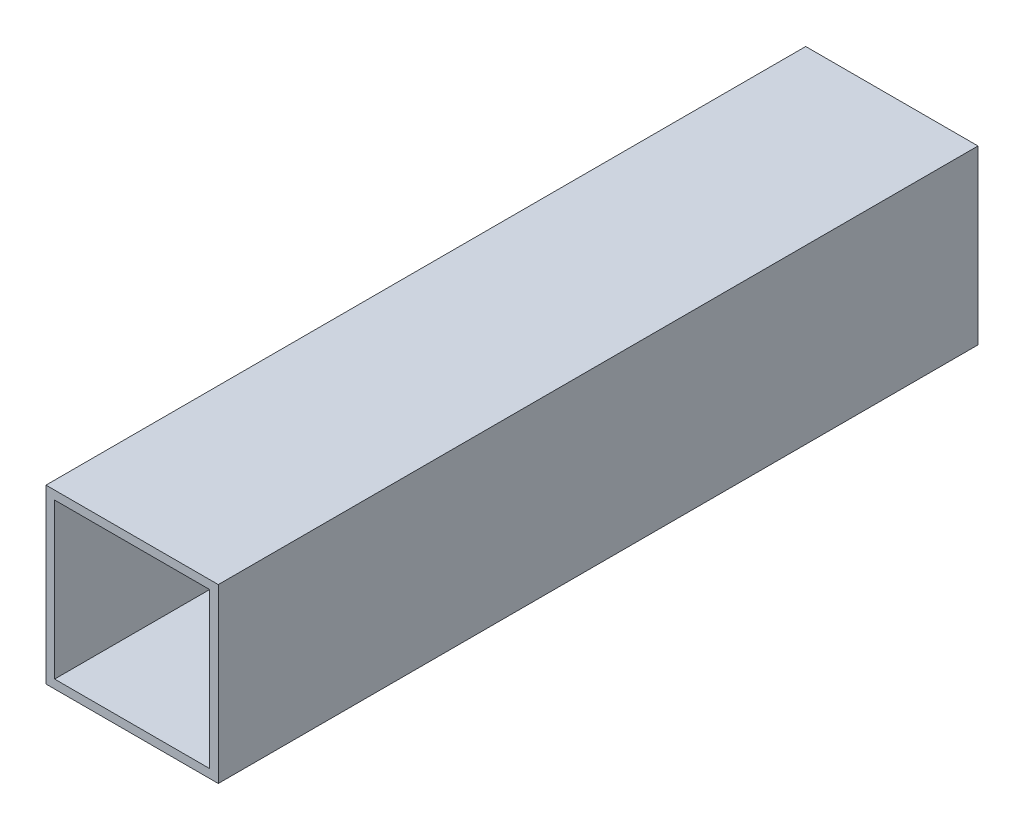
ISO-10303-21;
HEADER;
FILE_DESCRIPTION(('STEP AP214'),'2;1');
FILE_NAME('part.step','',(''),(''),'','','');
FILE_SCHEMA(('AUTOMOTIVE_DESIGN { 1 0 10303 214 1 1 1 1 }'));
ENDSEC;
DATA;
#1=APPLICATION_CONTEXT('core data for automotive mechanical design processes');
#2=APPLICATION_PROTOCOL_DEFINITION('international standard','automotive_design',2000,#1);
#3=PRODUCT_CONTEXT('',#1,'mechanical');
#4=PRODUCT('Part','Part','',(#3));
#5=PRODUCT_RELATED_PRODUCT_CATEGORY('part','',(#4));
#6=PRODUCT_DEFINITION_FORMATION('','',#4);
#7=PRODUCT_DEFINITION_CONTEXT('part definition',#1,'design');
#8=PRODUCT_DEFINITION('design','',#6,#7);
#9=PRODUCT_DEFINITION_SHAPE('','',#8);
#10=(LENGTH_UNIT() NAMED_UNIT(*) SI_UNIT(.MILLI.,.METRE.));
#11=(NAMED_UNIT(*) PLANE_ANGLE_UNIT() SI_UNIT($,.RADIAN.));
#12=(NAMED_UNIT(*) SI_UNIT($,.STERADIAN.) SOLID_ANGLE_UNIT());
#13=UNCERTAINTY_MEASURE_WITH_UNIT(LENGTH_MEASURE(1.E-05),#10,'distance_accuracy_value','');
#14=(GEOMETRIC_REPRESENTATION_CONTEXT(3) GLOBAL_UNCERTAINTY_ASSIGNED_CONTEXT((#13)) GLOBAL_UNIT_ASSIGNED_CONTEXT((#10,
#11,#12)) REPRESENTATION_CONTEXT('',''));
#15=CARTESIAN_POINT('',(0.,0.,0.));
#16=DIRECTION('',(0.,0.,1.));
#17=DIRECTION('',(1.,0.,0.));
#18=AXIS2_PLACEMENT_3D('',#15,#16,#17);
#19=CARTESIAN_POINT('',(0.,0.,140.));
#20=DIRECTION('',(0.,0.,1.));
#21=DIRECTION('',(1.,0.,0.));
#22=AXIS2_PLACEMENT_3D('',#19,#20,#21);
#23=PLANE('',#22);
#24=DIRECTION('',(0.,1.,0.));
#25=VECTOR('',#24,1.);
#26=CARTESIAN_POINT('',(15.875,15.875,140.));
#27=LINE('',#26,#25);
#28=CARTESIAN_POINT('',(15.875,-15.875,140.));
#29=VERTEX_POINT('',#28);
#30=CARTESIAN_POINT('',(15.875,15.875,140.));
#31=VERTEX_POINT('',#30);
#32=EDGE_CURVE('E134',#29,#31,#27,.T.);
#33=ORIENTED_EDGE('',*,*,#32,.T.);
#34=DIRECTION('',(-1.,0.,0.));
#35=VECTOR('',#34,1.);
#36=CARTESIAN_POINT('',(-15.875,15.875,140.));
#37=LINE('',#36,#35);
#38=CARTESIAN_POINT('',(-15.875,15.875,140.));
#39=VERTEX_POINT('',#38);
#40=EDGE_CURVE('E137',#31,#39,#37,.T.);
#41=ORIENTED_EDGE('',*,*,#40,.T.);
#42=DIRECTION('',(0.,-1.,0.));
#43=VECTOR('',#42,1.);
#44=CARTESIAN_POINT('',(-15.875,15.875,140.));
#45=LINE('',#44,#43);
#46=CARTESIAN_POINT('',(-15.875,-15.875,140.));
#47=VERTEX_POINT('',#46);
#48=EDGE_CURVE('E140',#39,#47,#45,.T.);
#49=ORIENTED_EDGE('',*,*,#48,.T.);
#50=DIRECTION('',(1.,0.,0.));
#51=VECTOR('',#50,1.);
#52=CARTESIAN_POINT('',(-15.875,-15.875,140.));
#53=LINE('',#52,#51);
#54=EDGE_CURVE('E142',#47,#29,#53,.T.);
#55=ORIENTED_EDGE('',*,*,#54,.T.);
#56=EDGE_LOOP('',(#33,#41,#49,#55));
#57=FACE_BOUND('',#56,.T.);
#58=DIRECTION('',(-1.,0.,0.));
#59=VECTOR('',#58,1.);
#60=CARTESIAN_POINT('',(-14.2875,14.2875,140.));
#61=LINE('',#60,#59);
#62=CARTESIAN_POINT('',(14.2875,14.2875,140.));
#63=VERTEX_POINT('',#62);
#64=CARTESIAN_POINT('',(-14.2875,14.2875,140.));
#65=VERTEX_POINT('',#64);
#66=EDGE_CURVE('E106',#63,#65,#61,.T.);
#67=ORIENTED_EDGE('',*,*,#66,.F.);
#68=DIRECTION('',(0.,1.,0.));
#69=VECTOR('',#68,1.);
#70=CARTESIAN_POINT('',(14.2875,14.2875,140.));
#71=LINE('',#70,#69);
#72=CARTESIAN_POINT('',(14.2875,-14.2875,140.));
#73=VERTEX_POINT('',#72);
#74=EDGE_CURVE('E98',#73,#63,#71,.T.);
#75=ORIENTED_EDGE('',*,*,#74,.F.);
#76=DIRECTION('',(1.,0.,0.));
#77=VECTOR('',#76,1.);
#78=CARTESIAN_POINT('',(-14.2875,-14.2875,140.));
#79=LINE('',#78,#77);
#80=CARTESIAN_POINT('',(-14.2875,-14.2875,140.));
#81=VERTEX_POINT('',#80);
#82=EDGE_CURVE('E120',#81,#73,#79,.T.);
#83=ORIENTED_EDGE('',*,*,#82,.F.);
#84=DIRECTION('',(0.,-1.,0.));
#85=VECTOR('',#84,1.);
#86=CARTESIAN_POINT('',(-14.2875,14.2875,140.));
#87=LINE('',#86,#85);
#88=EDGE_CURVE('E118',#65,#81,#87,.T.);
#89=ORIENTED_EDGE('',*,*,#88,.F.);
#90=EDGE_LOOP('',(#67,#75,#83,#89));
#91=FACE_BOUND('',#90,.T.);
#92=ADVANCED_FACE('F33',(#57,#91),#23,.T.);
#93=CARTESIAN_POINT('',(0.,0.,0.));
#94=DIRECTION('',(0.,0.,1.));
#95=DIRECTION('',(1.,0.,0.));
#96=AXIS2_PLACEMENT_3D('',#93,#94,#95);
#97=PLANE('',#96);
#98=DIRECTION('',(0.,1.,0.));
#99=VECTOR('',#98,1.);
#100=CARTESIAN_POINT('',(15.875,15.875,0.));
#101=LINE('',#100,#99);
#102=CARTESIAN_POINT('',(15.875,-15.875,0.));
#103=VERTEX_POINT('',#102);
#104=CARTESIAN_POINT('',(15.875,15.875,0.));
#105=VERTEX_POINT('',#104);
#106=EDGE_CURVE('E114',#103,#105,#101,.T.);
#107=ORIENTED_EDGE('',*,*,#106,.F.);
#108=DIRECTION('',(1.,0.,0.));
#109=VECTOR('',#108,1.);
#110=CARTESIAN_POINT('',(-15.875,-15.875,0.));
#111=LINE('',#110,#109);
#112=CARTESIAN_POINT('',(-15.875,-15.875,0.));
#113=VERTEX_POINT('',#112);
#114=EDGE_CURVE('E138',#113,#103,#111,.T.);
#115=ORIENTED_EDGE('',*,*,#114,.F.);
#116=DIRECTION('',(0.,-1.,0.));
#117=VECTOR('',#116,1.);
#118=CARTESIAN_POINT('',(-15.875,15.875,0.));
#119=LINE('',#118,#117);
#120=CARTESIAN_POINT('',(-15.875,15.875,0.));
#121=VERTEX_POINT('',#120);
#122=EDGE_CURVE('E149',#121,#113,#119,.T.);
#123=ORIENTED_EDGE('',*,*,#122,.F.);
#124=DIRECTION('',(-1.,0.,0.));
#125=VECTOR('',#124,1.);
#126=CARTESIAN_POINT('',(-15.875,15.875,0.));
#127=LINE('',#126,#125);
#128=EDGE_CURVE('E147',#105,#121,#127,.T.);
#129=ORIENTED_EDGE('',*,*,#128,.F.);
#130=EDGE_LOOP('',(#107,#115,#123,#129));
#131=FACE_BOUND('',#130,.T.);
#132=DIRECTION('',(0.,1.,0.));
#133=VECTOR('',#132,1.);
#134=CARTESIAN_POINT('',(14.2875,14.2875,0.));
#135=LINE('',#134,#133);
#136=CARTESIAN_POINT('',(14.2875,-14.2875,0.));
#137=VERTEX_POINT('',#136);
#138=CARTESIAN_POINT('',(14.2875,14.2875,0.));
#139=VERTEX_POINT('',#138);
#140=EDGE_CURVE('E56',#137,#139,#135,.T.);
#141=ORIENTED_EDGE('',*,*,#140,.T.);
#142=DIRECTION('',(-1.,0.,0.));
#143=VECTOR('',#142,1.);
#144=CARTESIAN_POINT('',(-14.2875,14.2875,0.));
#145=LINE('',#144,#143);
#146=CARTESIAN_POINT('',(-14.2875,14.2875,0.));
#147=VERTEX_POINT('',#146);
#148=EDGE_CURVE('E113',#139,#147,#145,.T.);
#149=ORIENTED_EDGE('',*,*,#148,.T.);
#150=DIRECTION('',(0.,-1.,0.));
#151=VECTOR('',#150,1.);
#152=CARTESIAN_POINT('',(-14.2875,14.2875,0.));
#153=LINE('',#152,#151);
#154=CARTESIAN_POINT('',(-14.2875,-14.2875,0.));
#155=VERTEX_POINT('',#154);
#156=EDGE_CURVE('E126',#147,#155,#153,.T.);
#157=ORIENTED_EDGE('',*,*,#156,.T.);
#158=DIRECTION('',(1.,0.,0.));
#159=VECTOR('',#158,1.);
#160=CARTESIAN_POINT('',(-14.2875,-14.2875,0.));
#161=LINE('',#160,#159);
#162=EDGE_CURVE('E107',#155,#137,#161,.T.);
#163=ORIENTED_EDGE('',*,*,#162,.T.);
#164=EDGE_LOOP('',(#141,#149,#157,#163));
#165=FACE_BOUND('',#164,.T.);
#166=ADVANCED_FACE('F167',(#131,#165),#97,.F.);
#167=CARTESIAN_POINT('',(15.875,15.875,140.));
#168=DIRECTION('',(-1.,0.,0.));
#169=DIRECTION('',(0.,-1.,0.));
#170=AXIS2_PLACEMENT_3D('',#167,#168,#169);
#171=PLANE('',#170);
#172=ORIENTED_EDGE('',*,*,#106,.T.);
#173=DIRECTION('',(0.,0.,-1.));
#174=VECTOR('',#173,1.);
#175=CARTESIAN_POINT('',(15.875,15.875,140.));
#176=LINE('',#175,#174);
#177=EDGE_CURVE('E11',#31,#105,#176,.T.);
#178=ORIENTED_EDGE('',*,*,#177,.F.);
#179=ORIENTED_EDGE('',*,*,#32,.F.);
#180=DIRECTION('',(0.,0.,-1.));
#181=VECTOR('',#180,1.);
#182=CARTESIAN_POINT('',(15.875,-15.875,140.));
#183=LINE('',#182,#181);
#184=EDGE_CURVE('E144',#29,#103,#183,.T.);
#185=ORIENTED_EDGE('',*,*,#184,.T.);
#186=EDGE_LOOP('',(#172,#178,#179,#185));
#187=FACE_BOUND('',#186,.T.);
#188=ADVANCED_FACE('F35',(#187),#171,.F.);
#189=CARTESIAN_POINT('',(-15.875,15.875,140.));
#190=DIRECTION('',(0.,-1.,0.));
#191=DIRECTION('',(0.,0.,-1.));
#192=AXIS2_PLACEMENT_3D('',#189,#190,#191);
#193=PLANE('',#192);
#194=ORIENTED_EDGE('',*,*,#128,.T.);
#195=DIRECTION('',(0.,0.,-1.));
#196=VECTOR('',#195,1.);
#197=CARTESIAN_POINT('',(-15.875,15.875,140.));
#198=LINE('',#197,#196);
#199=EDGE_CURVE('E41',#39,#121,#198,.T.);
#200=ORIENTED_EDGE('',*,*,#199,.F.);
#201=ORIENTED_EDGE('',*,*,#40,.F.);
#202=ORIENTED_EDGE('',*,*,#177,.T.);
#203=EDGE_LOOP('',(#194,#200,#201,#202));
#204=FACE_BOUND('',#203,.T.);
#205=ADVANCED_FACE('F177',(#204),#193,.F.);
#206=CARTESIAN_POINT('',(-15.875,15.875,140.));
#207=DIRECTION('',(1.,0.,0.));
#208=DIRECTION('',(0.,0.,-1.));
#209=AXIS2_PLACEMENT_3D('',#206,#207,#208);
#210=PLANE('',#209);
#211=ORIENTED_EDGE('',*,*,#122,.T.);
#212=DIRECTION('',(0.,0.,-1.));
#213=VECTOR('',#212,1.);
#214=CARTESIAN_POINT('',(-15.875,-15.875,140.));
#215=LINE('',#214,#213);
#216=EDGE_CURVE('E154',#47,#113,#215,.T.);
#217=ORIENTED_EDGE('',*,*,#216,.F.);
#218=ORIENTED_EDGE('',*,*,#48,.F.);
#219=ORIENTED_EDGE('',*,*,#199,.T.);
#220=EDGE_LOOP('',(#211,#217,#218,#219));
#221=FACE_BOUND('',#220,.T.);
#222=ADVANCED_FACE('F161',(#221),#210,.F.);
#223=CARTESIAN_POINT('',(-15.875,-15.875,140.));
#224=DIRECTION('',(0.,1.,0.));
#225=DIRECTION('',(0.,0.,1.));
#226=AXIS2_PLACEMENT_3D('',#223,#224,#225);
#227=PLANE('',#226);
#228=ORIENTED_EDGE('',*,*,#114,.T.);
#229=ORIENTED_EDGE('',*,*,#184,.F.);
#230=ORIENTED_EDGE('',*,*,#54,.F.);
#231=ORIENTED_EDGE('',*,*,#216,.T.);
#232=EDGE_LOOP('',(#228,#229,#230,#231));
#233=FACE_BOUND('',#232,.T.);
#234=ADVANCED_FACE('F171',(#233),#227,.F.);
#235=CARTESIAN_POINT('',(14.2875,14.2875,140.));
#236=DIRECTION('',(-1.,0.,0.));
#237=DIRECTION('',(0.,0.,1.));
#238=AXIS2_PLACEMENT_3D('',#235,#236,#237);
#239=PLANE('',#238);
#240=ORIENTED_EDGE('',*,*,#140,.F.);
#241=DIRECTION('',(0.,0.,-1.));
#242=VECTOR('',#241,1.);
#243=CARTESIAN_POINT('',(14.2875,-14.2875,140.));
#244=LINE('',#243,#242);
#245=EDGE_CURVE('E102',#73,#137,#244,.T.);
#246=ORIENTED_EDGE('',*,*,#245,.F.);
#247=ORIENTED_EDGE('',*,*,#74,.T.);
#248=DIRECTION('',(0.,0.,-1.));
#249=VECTOR('',#248,1.);
#250=CARTESIAN_POINT('',(14.2875,14.2875,140.));
#251=LINE('',#250,#249);
#252=EDGE_CURVE('E101',#63,#139,#251,.T.);
#253=ORIENTED_EDGE('',*,*,#252,.T.);
#254=EDGE_LOOP('',(#240,#246,#247,#253));
#255=FACE_BOUND('',#254,.T.);
#256=ADVANCED_FACE('F100',(#255),#239,.T.);
#257=CARTESIAN_POINT('',(-14.2875,14.2875,140.));
#258=DIRECTION('',(0.,-1.,0.));
#259=DIRECTION('',(0.,0.,-1.));
#260=AXIS2_PLACEMENT_3D('',#257,#258,#259);
#261=PLANE('',#260);
#262=ORIENTED_EDGE('',*,*,#148,.F.);
#263=ORIENTED_EDGE('',*,*,#252,.F.);
#264=ORIENTED_EDGE('',*,*,#66,.T.);
#265=DIRECTION('',(0.,0.,-1.));
#266=VECTOR('',#265,1.);
#267=CARTESIAN_POINT('',(-14.2875,14.2875,140.));
#268=LINE('',#267,#266);
#269=EDGE_CURVE('E115',#65,#147,#268,.T.);
#270=ORIENTED_EDGE('',*,*,#269,.T.);
#271=EDGE_LOOP('',(#262,#263,#264,#270));
#272=FACE_BOUND('',#271,.T.);
#273=ADVANCED_FACE('F110',(#272),#261,.T.);
#274=CARTESIAN_POINT('',(-14.2875,14.2875,140.));
#275=DIRECTION('',(1.,0.,0.));
#276=DIRECTION('',(0.,0.,-1.));
#277=AXIS2_PLACEMENT_3D('',#274,#275,#276);
#278=PLANE('',#277);
#279=ORIENTED_EDGE('',*,*,#156,.F.);
#280=ORIENTED_EDGE('',*,*,#269,.F.);
#281=ORIENTED_EDGE('',*,*,#88,.T.);
#282=DIRECTION('',(0.,0.,-1.));
#283=VECTOR('',#282,1.);
#284=CARTESIAN_POINT('',(-14.2875,-14.2875,140.));
#285=LINE('',#284,#283);
#286=EDGE_CURVE('E48',#81,#155,#285,.T.);
#287=ORIENTED_EDGE('',*,*,#286,.T.);
#288=EDGE_LOOP('',(#279,#280,#281,#287));
#289=FACE_BOUND('',#288,.T.);
#290=ADVANCED_FACE('F200',(#289),#278,.T.);
#291=CARTESIAN_POINT('',(-14.2875,-14.2875,140.));
#292=DIRECTION('',(0.,1.,0.));
#293=DIRECTION('',(0.,0.,1.));
#294=AXIS2_PLACEMENT_3D('',#291,#292,#293);
#295=PLANE('',#294);
#296=ORIENTED_EDGE('',*,*,#162,.F.);
#297=ORIENTED_EDGE('',*,*,#286,.F.);
#298=ORIENTED_EDGE('',*,*,#82,.T.);
#299=ORIENTED_EDGE('',*,*,#245,.T.);
#300=EDGE_LOOP('',(#296,#297,#298,#299));
#301=FACE_BOUND('',#300,.T.);
#302=ADVANCED_FACE('F204',(#301),#295,.T.);
#303=CLOSED_SHELL('',(#92,#166,#188,#205,#222,#234,#256,#273,#290,#302));
#304=MANIFOLD_SOLID_BREP('B2',#303);
#305=ADVANCED_BREP_SHAPE_REPRESENTATION('',(#18,#304),#14);
#306=SHAPE_DEFINITION_REPRESENTATION(#9,#305);
ENDSEC;
END-ISO-10303-21;
